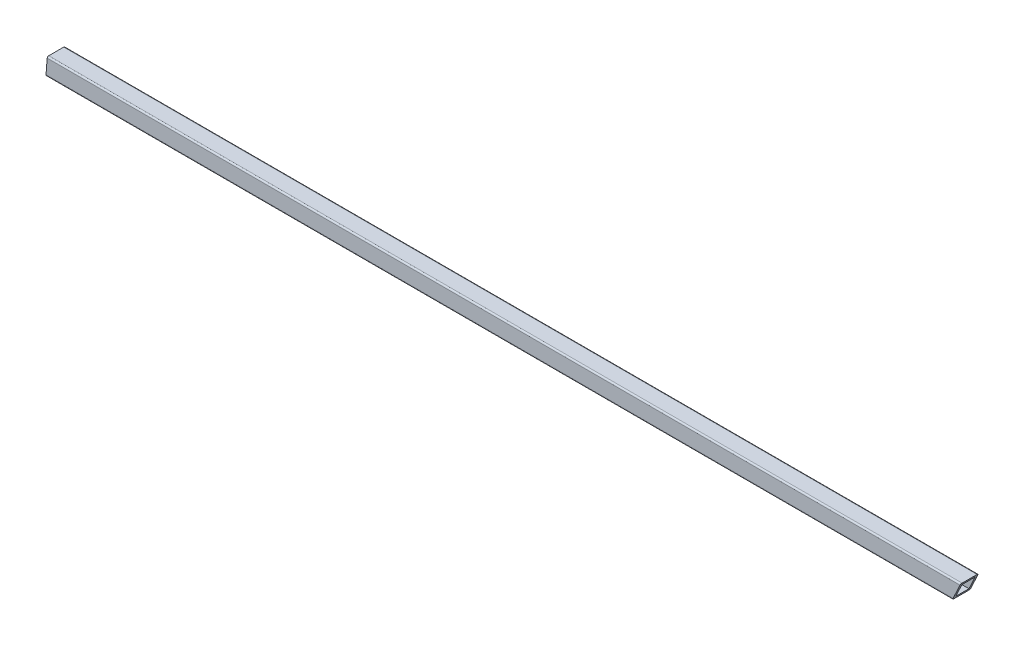
ISO-10303-21;
HEADER;
FILE_DESCRIPTION(('STEP AP214'),'2;1');
FILE_NAME('part.step','',(''),(''),'','','');
FILE_SCHEMA(('AUTOMOTIVE_DESIGN { 1 0 10303 214 1 1 1 1 }'));
ENDSEC;
DATA;
#1=APPLICATION_CONTEXT('core data for automotive mechanical design processes');
#2=APPLICATION_PROTOCOL_DEFINITION('international standard','automotive_design',2000,#1);
#3=PRODUCT_CONTEXT('',#1,'mechanical');
#4=PRODUCT('Part','Part','',(#3));
#5=PRODUCT_RELATED_PRODUCT_CATEGORY('part','',(#4));
#6=PRODUCT_DEFINITION_FORMATION('','',#4);
#7=PRODUCT_DEFINITION_CONTEXT('part definition',#1,'design');
#8=PRODUCT_DEFINITION('design','',#6,#7);
#9=PRODUCT_DEFINITION_SHAPE('','',#8);
#10=(LENGTH_UNIT() NAMED_UNIT(*) SI_UNIT(.MILLI.,.METRE.));
#11=(NAMED_UNIT(*) PLANE_ANGLE_UNIT() SI_UNIT($,.RADIAN.));
#12=(NAMED_UNIT(*) SI_UNIT($,.STERADIAN.) SOLID_ANGLE_UNIT());
#13=UNCERTAINTY_MEASURE_WITH_UNIT(LENGTH_MEASURE(1.E-05),#10,'distance_accuracy_value','');
#14=(GEOMETRIC_REPRESENTATION_CONTEXT(3) GLOBAL_UNCERTAINTY_ASSIGNED_CONTEXT((#13)) GLOBAL_UNIT_ASSIGNED_CONTEXT((#10,
#11,#12)) REPRESENTATION_CONTEXT('',''));
#15=CARTESIAN_POINT('',(0.,0.,0.));
#16=DIRECTION('',(0.,0.,1.));
#17=DIRECTION('',(1.,0.,0.));
#18=AXIS2_PLACEMENT_3D('',#15,#16,#17);
#19=CARTESIAN_POINT('',(1320.8,20.574,20.574));
#20=DIRECTION('',(0.,0.,-1.));
#21=DIRECTION('',(0.,1.,0.));
#22=AXIS2_PLACEMENT_3D('',#19,#20,#21);
#23=PLANE('',#22);
#24=DIRECTION('',(0.422618261740698,0.906307787036651,0.));
#25=VECTOR('',#24,1.);
#26=CARTESIAN_POINT('',(1320.16763031221,20.8688788282038,20.574));
#27=LINE('',#26,#25);
#28=CARTESIAN_POINT('',(1315.64776668505,11.176,20.574));
#29=VERTEX_POINT('',#28);
#30=CARTESIAN_POINT('',(1320.03012605639,20.574,20.574));
#31=VERTEX_POINT('',#30);
#32=EDGE_CURVE('E11',#29,#31,#27,.T.);
#33=ORIENTED_EDGE('',*,*,#32,.F.);
#34=DIRECTION('',(-1.,0.,0.));
#35=VECTOR('',#34,1.);
#36=CARTESIAN_POINT('',(1320.8,11.176,20.574));
#37=LINE('',#36,#35);
#38=CARTESIAN_POINT('',(669.229603526008,11.176,20.574));
#39=VERTEX_POINT('',#38);
#40=EDGE_CURVE('E169',#29,#39,#37,.T.);
#41=ORIENTED_EDGE('',*,*,#40,.T.);
#42=DIRECTION('',(-0.0785732652707514,-0.996908341817186,0.));
#43=VECTOR('',#42,1.);
#44=CARTESIAN_POINT('',(673.988390052857,71.5537120525033,20.574));
#45=LINE('',#44,#43);
#46=CARTESIAN_POINT('',(669.970325131034,20.574,20.574));
#47=VERTEX_POINT('',#46);
#48=EDGE_CURVE('E49',#47,#39,#45,.T.);
#49=ORIENTED_EDGE('',*,*,#48,.F.);
#50=DIRECTION('',(-1.,0.,0.));
#51=VECTOR('',#50,1.);
#52=CARTESIAN_POINT('',(1320.8,20.574,20.574));
#53=LINE('',#52,#51);
#54=EDGE_CURVE('E172',#31,#47,#53,.T.);
#55=ORIENTED_EDGE('',*,*,#54,.F.);
#56=EDGE_LOOP('',(#33,#41,#49,#55));
#57=FACE_BOUND('',#56,.T.);
#58=ADVANCED_FACE('F42',(#57),#23,.T.);
#59=CARTESIAN_POINT('',(1320.8,20.574,11.176));
#60=DIRECTION('',(0.,-1.,0.));
#61=DIRECTION('',(0.,0.,-1.));
#62=AXIS2_PLACEMENT_3D('',#59,#60,#61);
#63=PLANE('',#62);
#64=DIRECTION('',(0.,0.,-1.));
#65=VECTOR('',#64,1.);
#66=CARTESIAN_POINT('',(1320.03012605639,20.574,11.176));
#67=LINE('',#66,#65);
#68=CARTESIAN_POINT('',(1320.03012605639,20.574,11.176));
#69=VERTEX_POINT('',#68);
#70=EDGE_CURVE('E228',#31,#69,#67,.T.);
#71=ORIENTED_EDGE('',*,*,#70,.F.);
#72=ORIENTED_EDGE('',*,*,#54,.T.);
#73=DIRECTION('',(0.,0.,1.));
#74=VECTOR('',#73,1.);
#75=CARTESIAN_POINT('',(669.970325131034,20.574,11.176));
#76=LINE('',#75,#74);
#77=CARTESIAN_POINT('',(669.970325131034,20.574,11.176));
#78=VERTEX_POINT('',#77);
#79=EDGE_CURVE('E219',#78,#47,#76,.T.);
#80=ORIENTED_EDGE('',*,*,#79,.F.);
#81=DIRECTION('',(-1.,0.,0.));
#82=VECTOR('',#81,1.);
#83=CARTESIAN_POINT('',(1320.8,20.574,11.176));
#84=LINE('',#83,#82);
#85=EDGE_CURVE('E178',#69,#78,#84,.T.);
#86=ORIENTED_EDGE('',*,*,#85,.F.);
#87=EDGE_LOOP('',(#71,#72,#80,#86));
#88=FACE_BOUND('',#87,.T.);
#89=ADVANCED_FACE('F254',(#88),#63,.T.);
#90=CARTESIAN_POINT('',(1320.8,11.176,11.176));
#91=DIRECTION('',(0.,0.,1.));
#92=DIRECTION('',(1.,0.,0.));
#93=AXIS2_PLACEMENT_3D('',#90,#91,#92);
#94=PLANE('',#93);
#95=DIRECTION('',(-0.422618261740698,-0.906307787036651,0.));
#96=VECTOR('',#95,1.);
#97=CARTESIAN_POINT('',(1316.56798747399,13.1494198502867,11.176));
#98=LINE('',#97,#96);
#99=CARTESIAN_POINT('',(1315.64776668505,11.176,11.176));
#100=VERTEX_POINT('',#99);
#101=EDGE_CURVE('E230',#69,#100,#98,.T.);
#102=ORIENTED_EDGE('',*,*,#101,.F.);
#103=ORIENTED_EDGE('',*,*,#85,.T.);
#104=DIRECTION('',(0.0785732652707514,0.996908341817186,0.));
#105=VECTOR('',#104,1.);
#106=CARTESIAN_POINT('',(673.252241483777,62.2137330303311,11.176));
#107=LINE('',#106,#105);
#108=CARTESIAN_POINT('',(669.229603526009,11.176,11.176));
#109=VERTEX_POINT('',#108);
#110=EDGE_CURVE('E221',#109,#78,#107,.T.);
#111=ORIENTED_EDGE('',*,*,#110,.F.);
#112=DIRECTION('',(-1.,0.,0.));
#113=VECTOR('',#112,1.);
#114=CARTESIAN_POINT('',(1320.8,11.176,11.176));
#115=LINE('',#114,#113);
#116=EDGE_CURVE('E174',#100,#109,#115,.T.);
#117=ORIENTED_EDGE('',*,*,#116,.F.);
#118=EDGE_LOOP('',(#102,#103,#111,#117));
#119=FACE_BOUND('',#118,.T.);
#120=ADVANCED_FACE('F259',(#119),#94,.T.);
#121=CARTESIAN_POINT('',(1320.8,11.176,20.574));
#122=DIRECTION('',(0.,1.,0.));
#123=DIRECTION('',(0.,0.,1.));
#124=AXIS2_PLACEMENT_3D('',#121,#122,#123);
#125=PLANE('',#124);
#126=DIRECTION('',(0.,0.,1.));
#127=VECTOR('',#126,1.);
#128=CARTESIAN_POINT('',(1315.64776668505,11.176,20.574));
#129=LINE('',#128,#127);
#130=EDGE_CURVE('E208',#100,#29,#129,.T.);
#131=ORIENTED_EDGE('',*,*,#130,.F.);
#132=ORIENTED_EDGE('',*,*,#116,.T.);
#133=DIRECTION('',(0.,0.,-1.));
#134=VECTOR('',#133,1.);
#135=CARTESIAN_POINT('',(669.229603526008,11.176,20.574));
#136=LINE('',#135,#134);
#137=EDGE_CURVE('E223',#39,#109,#136,.T.);
#138=ORIENTED_EDGE('',*,*,#137,.F.);
#139=ORIENTED_EDGE('',*,*,#40,.F.);
#140=EDGE_LOOP('',(#131,#132,#138,#139));
#141=FACE_BOUND('',#140,.T.);
#142=ADVANCED_FACE('F268',(#141),#125,.T.);
#143=CARTESIAN_POINT('',(670.100451899485,22.225,22.225));
#144=DIRECTION('',(0.996908341817186,-0.0785732652707514,0.));
#145=DIRECTION('',(0.0785732652707514,0.996908341817186,0.));
#146=AXIS2_PLACEMENT_3D('',#143,#144,#145);
#147=PLANE('',#146);
#148=ORIENTED_EDGE('',*,*,#137,.T.);
#149=ORIENTED_EDGE('',*,*,#110,.T.);
#150=ORIENTED_EDGE('',*,*,#79,.T.);
#151=ORIENTED_EDGE('',*,*,#48,.T.);
#152=EDGE_LOOP('',(#148,#149,#150,#151));
#153=FACE_BOUND('',#152,.T.);
#154=DIRECTION('',(-0.0785732652707514,-0.996908341817186,0.));
#155=VECTOR('',#154,1.);
#156=CARTESIAN_POINT('',(670.100451899485,22.225,22.225));
#157=LINE('',#156,#155);
#158=CARTESIAN_POINT('',(670.020373888131,21.209,22.225));
#159=VERTEX_POINT('',#158);
#160=CARTESIAN_POINT('',(669.179554768912,10.541,22.225));
#161=VERTEX_POINT('',#160);
#162=EDGE_CURVE('E150',#159,#161,#157,.T.);
#163=ORIENTED_EDGE('',*,*,#162,.F.);
#164=CARTESIAN_POINT('',(670.020373888131,21.209,21.209));
#165=DIRECTION('',(0.996908341817186,-0.0785732652707514,0.));
#166=DIRECTION('',(-0.0785732652707514,-0.996908341817186,0.));
#167=AXIS2_PLACEMENT_3D('',#164,#165,#166);
#168=ELLIPSE('',#167,1.01915086611475,1.016);
#169=CARTESIAN_POINT('',(670.100451899485,22.225,21.209));
#170=VERTEX_POINT('',#169);
#171=EDGE_CURVE('E139',#170,#159,#168,.T.);
#172=ORIENTED_EDGE('',*,*,#171,.F.);
#173=DIRECTION('',(0.,0.,-1.));
#174=VECTOR('',#173,1.);
#175=CARTESIAN_POINT('',(670.100451899485,22.225,22.225));
#176=LINE('',#175,#174);
#177=CARTESIAN_POINT('',(670.100451899485,22.225,10.541));
#178=VERTEX_POINT('',#177);
#179=EDGE_CURVE('E133',#170,#178,#176,.T.);
#180=ORIENTED_EDGE('',*,*,#179,.T.);
#181=CARTESIAN_POINT('',(670.020373888131,21.209,10.541));
#182=DIRECTION('',(0.996908341817186,-0.0785732652707514,0.));
#183=DIRECTION('',(-0.0785732652707514,-0.996908341817186,0.));
#184=AXIS2_PLACEMENT_3D('',#181,#182,#183);
#185=ELLIPSE('',#184,1.01915086611474,1.016);
#186=CARTESIAN_POINT('',(670.020373888131,21.209,9.525));
#187=VERTEX_POINT('',#186);
#188=EDGE_CURVE('E127',#187,#178,#185,.T.);
#189=ORIENTED_EDGE('',*,*,#188,.F.);
#190=DIRECTION('',(-0.0785732652707514,-0.996908341817186,0.));
#191=VECTOR('',#190,1.);
#192=CARTESIAN_POINT('',(670.100451899485,22.225,9.525));
#193=LINE('',#192,#191);
#194=CARTESIAN_POINT('',(669.179554768912,10.541,9.525));
#195=VERTEX_POINT('',#194);
#196=EDGE_CURVE('E130',#187,#195,#193,.T.);
#197=ORIENTED_EDGE('',*,*,#196,.T.);
#198=CARTESIAN_POINT('',(669.179554768912,10.541,10.541));
#199=DIRECTION('',(0.996908341817186,-0.0785732652707514,0.));
#200=DIRECTION('',(-0.0785732652707514,-0.996908341817186,0.));
#201=AXIS2_PLACEMENT_3D('',#198,#199,#200);
#202=ELLIPSE('',#201,1.01915086611474,1.016);
#203=CARTESIAN_POINT('',(669.099476757558,9.525,10.541));
#204=VERTEX_POINT('',#203);
#205=EDGE_CURVE('E138',#204,#195,#202,.T.);
#206=ORIENTED_EDGE('',*,*,#205,.F.);
#207=DIRECTION('',(0.,0.,-1.));
#208=VECTOR('',#207,1.);
#209=CARTESIAN_POINT('',(669.099476757558,9.525,22.225));
#210=LINE('',#209,#208);
#211=CARTESIAN_POINT('',(669.099476757558,9.525,21.209));
#212=VERTEX_POINT('',#211);
#213=EDGE_CURVE('E211',#212,#204,#210,.T.);
#214=ORIENTED_EDGE('',*,*,#213,.F.);
#215=CARTESIAN_POINT('',(669.179554768912,10.541,21.209));
#216=DIRECTION('',(0.996908341817186,-0.0785732652707514,0.));
#217=DIRECTION('',(-0.0785732652707514,-0.996908341817186,0.));
#218=AXIS2_PLACEMENT_3D('',#215,#216,#217);
#219=ELLIPSE('',#218,1.01915086611474,1.016);
#220=EDGE_CURVE('E64',#161,#212,#219,.T.);
#221=ORIENTED_EDGE('',*,*,#220,.F.);
#222=EDGE_LOOP('',(#163,#172,#180,#189,#197,#206,#214,#221));
#223=FACE_BOUND('',#222,.T.);
#224=ADVANCED_FACE('F129',(#153,#223),#147,.F.);
#225=CARTESIAN_POINT('',(1320.8,22.225,22.225));
#226=DIRECTION('',(-0.906307787036651,0.422618261740698,0.));
#227=DIRECTION('',(-0.422618261740698,-0.906307787036651,0.));
#228=AXIS2_PLACEMENT_3D('',#225,#226,#227);
#229=PLANE('',#228);
#230=ORIENTED_EDGE('',*,*,#130,.T.);
#231=ORIENTED_EDGE('',*,*,#32,.T.);
#232=ORIENTED_EDGE('',*,*,#70,.T.);
#233=ORIENTED_EDGE('',*,*,#101,.T.);
#234=EDGE_LOOP('',(#230,#231,#232,#233));
#235=FACE_BOUND('',#234,.T.);
#236=DIRECTION('',(0.,0.,-1.));
#237=VECTOR('',#236,1.);
#238=CARTESIAN_POINT('',(1314.87789274143,9.525,22.225));
#239=LINE('',#238,#237);
#240=CARTESIAN_POINT('',(1314.87789274143,9.525,21.209));
#241=VERTEX_POINT('',#240);
#242=CARTESIAN_POINT('',(1314.87789274143,9.525,10.541));
#243=VERTEX_POINT('',#242);
#244=EDGE_CURVE('E216',#241,#243,#239,.T.);
#245=ORIENTED_EDGE('',*,*,#244,.T.);
#246=CARTESIAN_POINT('',(1315.35166132212,10.541,10.541));
#247=DIRECTION('',(-0.906307787036651,0.422618261740698,0.));
#248=DIRECTION('',(-0.422618261740698,-0.906307787036651,0.));
#249=AXIS2_PLACEMENT_3D('',#246,#247,#248);
#250=ELLIPSE('',#249,1.12103196566589,1.016);
#251=CARTESIAN_POINT('',(1315.35166132212,10.5409999999999,9.525));
#252=VERTEX_POINT('',#251);
#253=EDGE_CURVE('E234',#252,#243,#250,.T.);
#254=ORIENTED_EDGE('',*,*,#253,.F.);
#255=DIRECTION('',(0.422618261740698,0.906307787036651,0.));
#256=VECTOR('',#255,1.);
#257=CARTESIAN_POINT('',(1320.8,22.225,9.525));
#258=LINE('',#257,#256);
#259=CARTESIAN_POINT('',(1320.32623141931,21.209,9.525));
#260=VERTEX_POINT('',#259);
#261=EDGE_CURVE('E149',#252,#260,#258,.T.);
#262=ORIENTED_EDGE('',*,*,#261,.T.);
#263=CARTESIAN_POINT('',(1320.32623141931,21.209,10.541));
#264=DIRECTION('',(-0.906307787036651,0.422618261740698,0.));
#265=DIRECTION('',(-0.422618261740698,-0.906307787036651,0.));
#266=AXIS2_PLACEMENT_3D('',#263,#264,#265);
#267=ELLIPSE('',#266,1.12103196566589,1.016);
#268=CARTESIAN_POINT('',(1320.8,22.225,10.541));
#269=VERTEX_POINT('',#268);
#270=EDGE_CURVE('E154',#269,#260,#267,.T.);
#271=ORIENTED_EDGE('',*,*,#270,.F.);
#272=DIRECTION('',(0.,0.,1.));
#273=VECTOR('',#272,1.);
#274=CARTESIAN_POINT('',(1320.8,22.225,10.541));
#275=LINE('',#274,#273);
#276=CARTESIAN_POINT('',(1320.8,22.225,21.209));
#277=VERTEX_POINT('',#276);
#278=EDGE_CURVE('E177',#269,#277,#275,.T.);
#279=ORIENTED_EDGE('',*,*,#278,.T.);
#280=CARTESIAN_POINT('',(1320.32623141931,21.209,21.209));
#281=DIRECTION('',(-0.906307787036651,0.422618261740698,0.));
#282=DIRECTION('',(-0.422618261740698,-0.906307787036651,0.));
#283=AXIS2_PLACEMENT_3D('',#280,#281,#282);
#284=ELLIPSE('',#283,1.12103196566589,1.016);
#285=CARTESIAN_POINT('',(1320.32623141931,21.209,22.225));
#286=VERTEX_POINT('',#285);
#287=EDGE_CURVE('E56',#286,#277,#284,.T.);
#288=ORIENTED_EDGE('',*,*,#287,.F.);
#289=DIRECTION('',(0.422618261740698,0.906307787036651,0.));
#290=VECTOR('',#289,1.);
#291=CARTESIAN_POINT('',(1320.8,22.225,22.225));
#292=LINE('',#291,#290);
#293=CARTESIAN_POINT('',(1315.35166132212,10.541,22.225));
#294=VERTEX_POINT('',#293);
#295=EDGE_CURVE('E239',#294,#286,#292,.T.);
#296=ORIENTED_EDGE('',*,*,#295,.F.);
#297=CARTESIAN_POINT('',(1315.35166132212,10.541,21.209));
#298=DIRECTION('',(-0.906307787036651,0.422618261740698,0.));
#299=DIRECTION('',(-0.422618261740698,-0.906307787036651,0.));
#300=AXIS2_PLACEMENT_3D('',#297,#298,#299);
#301=ELLIPSE('',#300,1.12103196566589,1.016);
#302=EDGE_CURVE('E173',#241,#294,#301,.T.);
#303=ORIENTED_EDGE('',*,*,#302,.F.);
#304=EDGE_LOOP('',(#245,#254,#262,#271,#279,#288,#296,#303));
#305=FACE_BOUND('',#304,.T.);
#306=ADVANCED_FACE('F201',(#235,#305),#229,.F.);
#307=CARTESIAN_POINT('',(1320.8,21.209,22.225));
#308=DIRECTION('',(0.,0.,-1.));
#309=DIRECTION('',(0.,1.,0.));
#310=AXIS2_PLACEMENT_3D('',#307,#308,#309);
#311=PLANE('',#310);
#312=DIRECTION('',(-1.,0.,0.));
#313=VECTOR('',#312,1.);
#314=CARTESIAN_POINT('',(1320.8,10.541,22.225));
#315=LINE('',#314,#313);
#316=EDGE_CURVE('E168',#294,#161,#315,.T.);
#317=ORIENTED_EDGE('',*,*,#316,.F.);
#318=ORIENTED_EDGE('',*,*,#295,.T.);
#319=DIRECTION('',(-1.,0.,0.));
#320=VECTOR('',#319,1.);
#321=CARTESIAN_POINT('',(1320.8,21.209,22.225));
#322=LINE('',#321,#320);
#323=EDGE_CURVE('E165',#286,#159,#322,.T.);
#324=ORIENTED_EDGE('',*,*,#323,.T.);
#325=ORIENTED_EDGE('',*,*,#162,.T.);
#326=EDGE_LOOP('',(#317,#318,#324,#325));
#327=FACE_BOUND('',#326,.T.);
#328=ADVANCED_FACE('F238',(#327),#311,.F.);
#329=CARTESIAN_POINT('',(1320.8,21.209,21.209));
#330=DIRECTION('',(-1.,0.,0.));
#331=DIRECTION('',(0.,0.,1.));
#332=AXIS2_PLACEMENT_3D('',#329,#330,#331);
#333=CYLINDRICAL_SURFACE('',#332,1.016);
#334=ORIENTED_EDGE('',*,*,#323,.F.);
#335=ORIENTED_EDGE('',*,*,#287,.T.);
#336=DIRECTION('',(-1.,0.,0.));
#337=VECTOR('',#336,1.);
#338=CARTESIAN_POINT('',(1320.8,22.225,21.209));
#339=LINE('',#338,#337);
#340=EDGE_CURVE('E159',#277,#170,#339,.T.);
#341=ORIENTED_EDGE('',*,*,#340,.T.);
#342=ORIENTED_EDGE('',*,*,#171,.T.);
#343=EDGE_LOOP('',(#334,#335,#341,#342));
#344=FACE_BOUND('',#343,.T.);
#345=ADVANCED_FACE('F206',(#344),#333,.T.);
#346=CARTESIAN_POINT('',(1320.8,22.225,10.541));
#347=DIRECTION('',(0.,-1.,0.));
#348=DIRECTION('',(0.,0.,-1.));
#349=AXIS2_PLACEMENT_3D('',#346,#347,#348);
#350=PLANE('',#349);
#351=DIRECTION('',(-1.,0.,0.));
#352=VECTOR('',#351,1.);
#353=CARTESIAN_POINT('',(1320.8,22.225,10.541));
#354=LINE('',#353,#352);
#355=EDGE_CURVE('E155',#269,#178,#354,.T.);
#356=ORIENTED_EDGE('',*,*,#355,.T.);
#357=ORIENTED_EDGE('',*,*,#179,.F.);
#358=ORIENTED_EDGE('',*,*,#340,.F.);
#359=ORIENTED_EDGE('',*,*,#278,.F.);
#360=EDGE_LOOP('',(#356,#357,#358,#359));
#361=FACE_BOUND('',#360,.T.);
#362=ADVANCED_FACE('F210',(#361),#350,.F.);
#363=CARTESIAN_POINT('',(1320.8,21.209,10.541));
#364=DIRECTION('',(-1.,0.,0.));
#365=DIRECTION('',(0.,0.,1.));
#366=AXIS2_PLACEMENT_3D('',#363,#364,#365);
#367=CYLINDRICAL_SURFACE('',#366,1.016);
#368=ORIENTED_EDGE('',*,*,#355,.F.);
#369=ORIENTED_EDGE('',*,*,#270,.T.);
#370=DIRECTION('',(-1.,0.,0.));
#371=VECTOR('',#370,1.);
#372=CARTESIAN_POINT('',(1320.8,21.209,9.525));
#373=LINE('',#372,#371);
#374=EDGE_CURVE('E146',#260,#187,#373,.T.);
#375=ORIENTED_EDGE('',*,*,#374,.T.);
#376=ORIENTED_EDGE('',*,*,#188,.T.);
#377=EDGE_LOOP('',(#368,#369,#375,#376));
#378=FACE_BOUND('',#377,.T.);
#379=ADVANCED_FACE('F153',(#378),#367,.T.);
#380=CARTESIAN_POINT('',(1320.8,10.541,9.525));
#381=DIRECTION('',(0.,0.,1.));
#382=DIRECTION('',(1.,0.,0.));
#383=AXIS2_PLACEMENT_3D('',#380,#381,#382);
#384=PLANE('',#383);
#385=ORIENTED_EDGE('',*,*,#374,.F.);
#386=ORIENTED_EDGE('',*,*,#261,.F.);
#387=DIRECTION('',(-1.,0.,0.));
#388=VECTOR('',#387,1.);
#389=CARTESIAN_POINT('',(1320.8,10.541,9.525));
#390=LINE('',#389,#388);
#391=EDGE_CURVE('E148',#252,#195,#390,.T.);
#392=ORIENTED_EDGE('',*,*,#391,.T.);
#393=ORIENTED_EDGE('',*,*,#196,.F.);
#394=EDGE_LOOP('',(#385,#386,#392,#393));
#395=FACE_BOUND('',#394,.T.);
#396=ADVANCED_FACE('F144',(#395),#384,.F.);
#397=CARTESIAN_POINT('',(1320.8,10.541,10.541));
#398=DIRECTION('',(-1.,0.,0.));
#399=DIRECTION('',(0.,0.,1.));
#400=AXIS2_PLACEMENT_3D('',#397,#398,#399);
#401=CYLINDRICAL_SURFACE('',#400,1.016);
#402=ORIENTED_EDGE('',*,*,#391,.F.);
#403=ORIENTED_EDGE('',*,*,#253,.T.);
#404=DIRECTION('',(-1.,0.,0.));
#405=VECTOR('',#404,1.);
#406=CARTESIAN_POINT('',(1320.8,9.525,10.541));
#407=LINE('',#406,#405);
#408=EDGE_CURVE('E157',#243,#204,#407,.T.);
#409=ORIENTED_EDGE('',*,*,#408,.T.);
#410=ORIENTED_EDGE('',*,*,#205,.T.);
#411=EDGE_LOOP('',(#402,#403,#409,#410));
#412=FACE_BOUND('',#411,.T.);
#413=ADVANCED_FACE('F242',(#412),#401,.T.);
#414=CARTESIAN_POINT('',(1320.8,9.525,21.209));
#415=DIRECTION('',(0.,1.,0.));
#416=DIRECTION('',(0.,0.,1.));
#417=AXIS2_PLACEMENT_3D('',#414,#415,#416);
#418=PLANE('',#417);
#419=ORIENTED_EDGE('',*,*,#408,.F.);
#420=ORIENTED_EDGE('',*,*,#244,.F.);
#421=DIRECTION('',(-1.,0.,0.));
#422=VECTOR('',#421,1.);
#423=CARTESIAN_POINT('',(1320.8,9.525,21.209));
#424=LINE('',#423,#422);
#425=EDGE_CURVE('E182',#241,#212,#424,.T.);
#426=ORIENTED_EDGE('',*,*,#425,.T.);
#427=ORIENTED_EDGE('',*,*,#213,.T.);
#428=EDGE_LOOP('',(#419,#420,#426,#427));
#429=FACE_BOUND('',#428,.T.);
#430=ADVANCED_FACE('F244',(#429),#418,.F.);
#431=CARTESIAN_POINT('',(1320.8,10.541,21.209));
#432=DIRECTION('',(-1.,0.,0.));
#433=DIRECTION('',(0.,0.,1.));
#434=AXIS2_PLACEMENT_3D('',#431,#432,#433);
#435=CYLINDRICAL_SURFACE('',#434,1.016);
#436=ORIENTED_EDGE('',*,*,#425,.F.);
#437=ORIENTED_EDGE('',*,*,#302,.T.);
#438=ORIENTED_EDGE('',*,*,#316,.T.);
#439=ORIENTED_EDGE('',*,*,#220,.T.);
#440=EDGE_LOOP('',(#436,#437,#438,#439));
#441=FACE_BOUND('',#440,.T.);
#442=ADVANCED_FACE('F236',(#441),#435,.T.);
#443=CLOSED_SHELL('',(#58,#89,#120,#142,#224,#306,#328,#345,#362,#379,#396,#413,#430,#442));
#444=MANIFOLD_SOLID_BREP('B2',#443);
#445=ADVANCED_BREP_SHAPE_REPRESENTATION('',(#18,#444),#14);
#446=SHAPE_DEFINITION_REPRESENTATION(#9,#445);
ENDSEC;
END-ISO-10303-21;
